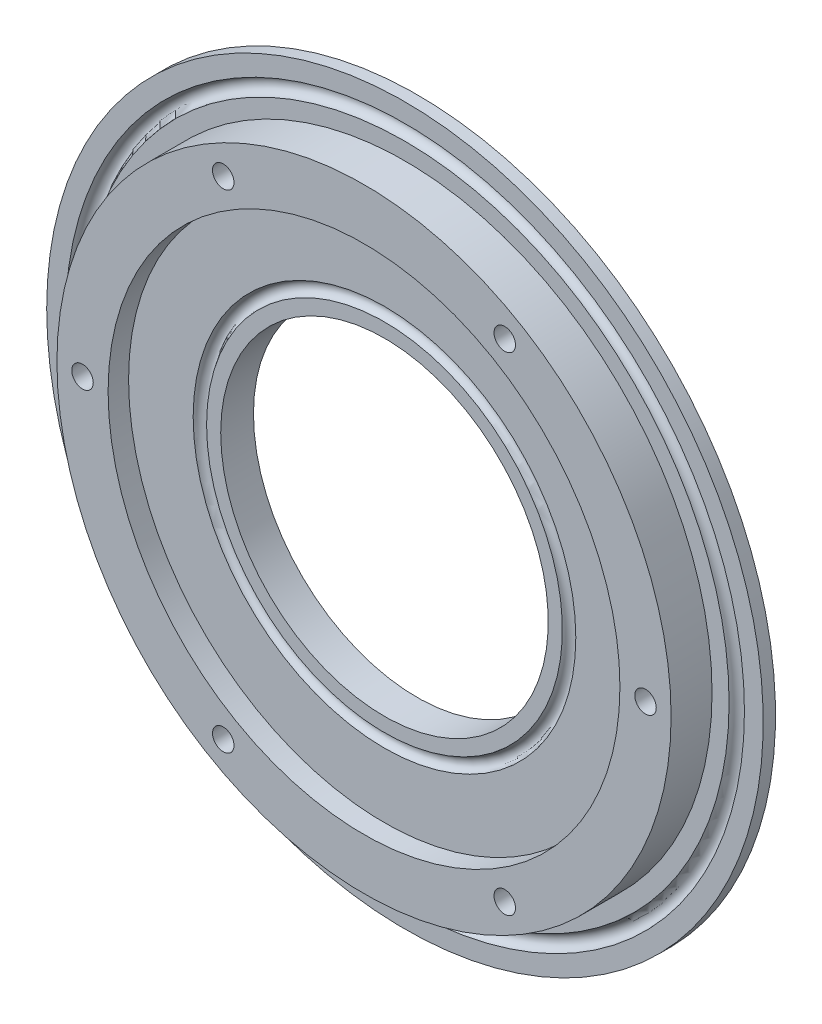
ISO-10303-21;
HEADER;
FILE_DESCRIPTION(('STEP AP214'),'2;1');
FILE_NAME('part.step','',(''),(''),'','','');
FILE_SCHEMA(('AUTOMOTIVE_DESIGN { 1 0 10303 214 1 1 1 1 }'));
ENDSEC;
DATA;
#1=APPLICATION_CONTEXT('core data for automotive mechanical design processes');
#2=APPLICATION_PROTOCOL_DEFINITION('international standard','automotive_design',2000,#1);
#3=PRODUCT_CONTEXT('',#1,'mechanical');
#4=PRODUCT('Part','Part','',(#3));
#5=PRODUCT_RELATED_PRODUCT_CATEGORY('part','',(#4));
#6=PRODUCT_DEFINITION_FORMATION('','',#4);
#7=PRODUCT_DEFINITION_CONTEXT('part definition',#1,'design');
#8=PRODUCT_DEFINITION('design','',#6,#7);
#9=PRODUCT_DEFINITION_SHAPE('','',#8);
#10=(LENGTH_UNIT() NAMED_UNIT(*) SI_UNIT(.MILLI.,.METRE.));
#11=(NAMED_UNIT(*) PLANE_ANGLE_UNIT() SI_UNIT($,.RADIAN.));
#12=(NAMED_UNIT(*) SI_UNIT($,.STERADIAN.) SOLID_ANGLE_UNIT());
#13=UNCERTAINTY_MEASURE_WITH_UNIT(LENGTH_MEASURE(1.E-05),#10,'distance_accuracy_value','');
#14=(GEOMETRIC_REPRESENTATION_CONTEXT(3) GLOBAL_UNCERTAINTY_ASSIGNED_CONTEXT((#13)) GLOBAL_UNIT_ASSIGNED_CONTEXT((#10,
#11,#12)) REPRESENTATION_CONTEXT('',''));
#15=CARTESIAN_POINT('',(0.,0.,0.));
#16=DIRECTION('',(0.,0.,1.));
#17=DIRECTION('',(1.,0.,0.));
#18=AXIS2_PLACEMENT_3D('',#15,#16,#17);
#19=CARTESIAN_POINT('',(0.,1.11022302462516E-13,-1.99999999999992));
#20=DIRECTION('',(0.,0.,-1.));
#21=DIRECTION('',(-1.00000000000001,0.,0.));
#22=AXIS2_PLACEMENT_3D('',#19,#20,#21);
#23=TOROIDAL_SURFACE('',#22,64.83,1.5);
#24=CARTESIAN_POINT('',(0.,1.11022302462516E-13,-2.));
#25=DIRECTION('',(0.,0.,-1.));
#26=DIRECTION('',(-1.00000000000001,0.,0.));
#27=AXIS2_PLACEMENT_3D('',#24,#25,#26);
#28=CIRCLE('',#27,63.33);
#29=CARTESIAN_POINT('',(-63.3300000000007,2.79767320421342E-13,-2.));
#30=VERTEX_POINT('',#29);
#31=EDGE_CURVE('E13',#30,#30,#28,.T.);
#32=ORIENTED_EDGE('',*,*,#31,.T.);
#33=EDGE_LOOP('',(#32));
#34=FACE_BOUND('',#33,.T.);
#35=CARTESIAN_POINT('',(0.,1.11022302462516E-13,-2.));
#36=DIRECTION('',(0.,0.,-1.));
#37=DIRECTION('',(-1.00000000000001,0.,0.));
#38=AXIS2_PLACEMENT_3D('',#35,#36,#37);
#39=CIRCLE('',#38,66.33);
#40=CARTESIAN_POINT('',(-66.3300000000007,2.87760926198644E-13,-2.));
#41=VERTEX_POINT('',#40);
#42=EDGE_CURVE('E122',#41,#41,#39,.T.);
#43=ORIENTED_EDGE('',*,*,#42,.F.);
#44=EDGE_LOOP('',(#43));
#45=FACE_BOUND('',#44,.T.);
#46=ADVANCED_FACE('F51',(#34,#45),#23,.F.);
#47=CARTESIAN_POINT('',(-60.0000000000007,4.44089209850063E-13,-2.));
#48=DIRECTION('',(0.,0.,1.));
#49=DIRECTION('',(1.00000000000001,0.,0.));
#50=AXIS2_PLACEMENT_3D('',#47,#48,#49);
#51=PLANE('',#50);
#52=CARTESIAN_POINT('',(0.,1.11022302462516E-13,-2.));
#53=DIRECTION('',(0.,0.,-1.));
#54=DIRECTION('',(-1.00000000000001,0.,0.));
#55=AXIS2_PLACEMENT_3D('',#52,#53,#54);
#56=CIRCLE('',#55,60.);
#57=CARTESIAN_POINT('',(-60.0000000000006,2.70894418008538E-13,-2.));
#58=VERTEX_POINT('',#57);
#59=EDGE_CURVE('E58',#58,#58,#56,.T.);
#60=ORIENTED_EDGE('',*,*,#59,.T.);
#61=EDGE_LOOP('',(#60));
#62=FACE_BOUND('',#61,.T.);
#63=ORIENTED_EDGE('',*,*,#31,.F.);
#64=EDGE_LOOP('',(#63));
#65=FACE_BOUND('',#64,.T.);
#66=ADVANCED_FACE('F154',(#62,#65),#51,.T.);
#67=CARTESIAN_POINT('',(0.,0.,-4.82603398798231));
#68=DIRECTION('',(0.,0.,-1.));
#69=DIRECTION('',(-1.00000000000001,0.,0.));
#70=AXIS2_PLACEMENT_3D('',#67,#68,#69);
#71=CYLINDRICAL_SURFACE('',#70,60.);
#72=CARTESIAN_POINT('',(0.,0.,6.00000000000001));
#73=DIRECTION('',(0.,0.,-1.));
#74=DIRECTION('',(-1.00000000000001,0.,0.));
#75=AXIS2_PLACEMENT_3D('',#72,#73,#74);
#76=CIRCLE('',#75,60.);
#77=CARTESIAN_POINT('',(-60.0000000000006,1.87627691161651E-13,6.00000000000001));
#78=VERTEX_POINT('',#77);
#79=EDGE_CURVE('E149',#78,#78,#76,.T.);
#80=ORIENTED_EDGE('',*,*,#79,.T.);
#81=EDGE_LOOP('',(#80));
#82=FACE_BOUND('',#81,.T.);
#83=ORIENTED_EDGE('',*,*,#59,.F.);
#84=EDGE_LOOP('',(#83));
#85=FACE_BOUND('',#84,.T.);
#86=ADVANCED_FACE('F157',(#82,#85),#71,.T.);
#87=CARTESIAN_POINT('',(-50.0000000000006,2.91433543964104E-13,5.99999999999937));
#88=DIRECTION('',(0.,0.,1.));
#89=DIRECTION('',(1.00000000000001,0.,0.));
#90=AXIS2_PLACEMENT_3D('',#87,#88,#89);
#91=PLANE('',#90);
#92=CARTESIAN_POINT('',(-27.5000000000003,47.6313972081445,6.00000000000001));
#93=DIRECTION('',(0.,0.,1.));
#94=DIRECTION('',(1.00000000000001,0.,0.));
#95=AXIS2_PLACEMENT_3D('',#92,#93,#94);
#96=CIRCLE('',#95,2.09999999999999);
#97=CARTESIAN_POINT('',(-25.4000000000003,47.6313972081445,6.00000000000001));
#98=VERTEX_POINT('',#97);
#99=EDGE_CURVE('E88',#98,#98,#96,.T.);
#100=ORIENTED_EDGE('',*,*,#99,.F.);
#101=EDGE_LOOP('',(#100));
#102=FACE_BOUND('',#101,.T.);
#103=CARTESIAN_POINT('',(27.5000000000002,47.6313972081442,6.00000000000001));
#104=DIRECTION('',(0.,0.,1.));
#105=DIRECTION('',(1.00000000000001,0.,0.));
#106=AXIS2_PLACEMENT_3D('',#103,#104,#105);
#107=CIRCLE('',#106,2.09999999999999);
#108=CARTESIAN_POINT('',(29.6000000000002,47.6313972081442,6.00000000000001));
#109=VERTEX_POINT('',#108);
#110=EDGE_CURVE('E87',#109,#109,#107,.T.);
#111=ORIENTED_EDGE('',*,*,#110,.F.);
#112=EDGE_LOOP('',(#111));
#113=FACE_BOUND('',#112,.T.);
#114=CARTESIAN_POINT('',(55.0000000000005,0.,6.00000000000001));
#115=DIRECTION('',(0.,0.,1.));
#116=DIRECTION('',(1.00000000000001,0.,0.));
#117=AXIS2_PLACEMENT_3D('',#114,#115,#116);
#118=CIRCLE('',#117,2.09999999999999);
#119=CARTESIAN_POINT('',(57.1000000000005,0.,6.00000000000001));
#120=VERTEX_POINT('',#119);
#121=EDGE_CURVE('E98',#120,#120,#118,.T.);
#122=ORIENTED_EDGE('',*,*,#121,.F.);
#123=EDGE_LOOP('',(#122));
#124=FACE_BOUND('',#123,.T.);
#125=CARTESIAN_POINT('',(27.5000000000001,-47.6313972081441,6.00000000000001));
#126=DIRECTION('',(0.,0.,1.));
#127=DIRECTION('',(1.00000000000001,0.,0.));
#128=AXIS2_PLACEMENT_3D('',#125,#126,#127);
#129=CIRCLE('',#128,2.09999999999999);
#130=CARTESIAN_POINT('',(29.6000000000001,-47.6313972081441,6.00000000000001));
#131=VERTEX_POINT('',#130);
#132=EDGE_CURVE('E104',#131,#131,#129,.T.);
#133=ORIENTED_EDGE('',*,*,#132,.F.);
#134=EDGE_LOOP('',(#133));
#135=FACE_BOUND('',#134,.T.);
#136=CARTESIAN_POINT('',(-27.5,-47.6313972081441,6.00000000000001));
#137=DIRECTION('',(0.,0.,1.));
#138=DIRECTION('',(1.00000000000001,0.,0.));
#139=AXIS2_PLACEMENT_3D('',#136,#137,#138);
#140=CIRCLE('',#139,2.09999999999999);
#141=CARTESIAN_POINT('',(-25.4,-47.6313972081441,6.00000000000001));
#142=VERTEX_POINT('',#141);
#143=EDGE_CURVE('E110',#142,#142,#140,.T.);
#144=ORIENTED_EDGE('',*,*,#143,.F.);
#145=EDGE_LOOP('',(#144));
#146=FACE_BOUND('',#145,.T.);
#147=CARTESIAN_POINT('',(-55.0000000000006,3.46944695195361E-13,6.00000000000001));
#148=DIRECTION('',(0.,0.,1.));
#149=DIRECTION('',(1.00000000000001,0.,0.));
#150=AXIS2_PLACEMENT_3D('',#147,#148,#149);
#151=CIRCLE('',#150,2.09999999999999);
#152=CARTESIAN_POINT('',(-52.9000000000006,3.41349171151251E-13,6.00000000000001));
#153=VERTEX_POINT('',#152);
#154=EDGE_CURVE('E116',#153,#153,#151,.T.);
#155=ORIENTED_EDGE('',*,*,#154,.F.);
#156=EDGE_LOOP('',(#155));
#157=FACE_BOUND('',#156,.T.);
#158=CARTESIAN_POINT('',(0.,0.,6.00000000000001));
#159=DIRECTION('',(0.,0.,-1.));
#160=DIRECTION('',(-1.00000000000001,0.,0.));
#161=AXIS2_PLACEMENT_3D('',#158,#159,#160);
#162=CIRCLE('',#161,50.);
#163=CARTESIAN_POINT('',(-50.0000000000005,1.60982338570648E-13,6.00000000000001));
#164=VERTEX_POINT('',#163);
#165=EDGE_CURVE('E146',#164,#164,#162,.T.);
#166=ORIENTED_EDGE('',*,*,#165,.T.);
#167=EDGE_LOOP('',(#166));
#168=FACE_BOUND('',#167,.T.);
#169=ORIENTED_EDGE('',*,*,#79,.F.);
#170=EDGE_LOOP('',(#169));
#171=FACE_BOUND('',#170,.T.);
#172=ADVANCED_FACE('F159',(#102,#113,#124,#135,#146,#157,#168,#171),#91,.T.);
#173=CARTESIAN_POINT('',(0.,0.,-4.82603398798231));
#174=DIRECTION('',(0.,0.,-1.));
#175=DIRECTION('',(-1.00000000000001,0.,0.));
#176=AXIS2_PLACEMENT_3D('',#173,#174,#175);
#177=CYLINDRICAL_SURFACE('',#176,50.);
#178=CARTESIAN_POINT('',(0.,0.,2.));
#179=DIRECTION('',(0.,0.,-1.));
#180=DIRECTION('',(-1.00000000000001,0.,0.));
#181=AXIS2_PLACEMENT_3D('',#178,#179,#180);
#182=CIRCLE('',#181,50.);
#183=CARTESIAN_POINT('',(-50.0000000000005,1.60982338570648E-13,2.));
#184=VERTEX_POINT('',#183);
#185=EDGE_CURVE('E143',#184,#184,#182,.T.);
#186=ORIENTED_EDGE('',*,*,#185,.T.);
#187=EDGE_LOOP('',(#186));
#188=FACE_BOUND('',#187,.T.);
#189=ORIENTED_EDGE('',*,*,#165,.F.);
#190=EDGE_LOOP('',(#189));
#191=FACE_BOUND('',#190,.T.);
#192=ADVANCED_FACE('F166',(#188,#191),#177,.F.);
#193=CARTESIAN_POINT('',(-37.3800000000004,1.94289029309402E-13,1.99999999999997));
#194=DIRECTION('',(0.,0.,1.));
#195=DIRECTION('',(1.00000000000001,0.,0.));
#196=AXIS2_PLACEMENT_3D('',#193,#194,#195);
#197=PLANE('',#196);
#198=CARTESIAN_POINT('',(0.,0.,2.));
#199=DIRECTION('',(0.,0.,-1.));
#200=DIRECTION('',(-1.00000000000001,0.,0.));
#201=AXIS2_PLACEMENT_3D('',#198,#199,#200);
#202=CIRCLE('',#201,37.38);
#203=CARTESIAN_POINT('',(-37.3800000000004,1.27355903600801E-13,2.));
#204=VERTEX_POINT('',#203);
#205=EDGE_CURVE('E140',#204,#204,#202,.T.);
#206=ORIENTED_EDGE('',*,*,#205,.T.);
#207=EDGE_LOOP('',(#206));
#208=FACE_BOUND('',#207,.T.);
#209=ORIENTED_EDGE('',*,*,#185,.F.);
#210=EDGE_LOOP('',(#209));
#211=FACE_BOUND('',#210,.T.);
#212=ADVANCED_FACE('F211',(#208,#211),#197,.T.);
#213=CARTESIAN_POINT('',(0.,0.,2.16217274740227));
#214=DIRECTION('',(0.,0.,-1.));
#215=DIRECTION('',(-1.00000000000001,0.,0.));
#216=AXIS2_PLACEMENT_3D('',#213,#214,#215);
#217=TOROIDAL_SURFACE('',#216,36.07,1.32);
#218=CARTESIAN_POINT('',(0.,0.,2.));
#219=DIRECTION('',(0.,0.,-1.));
#220=DIRECTION('',(-1.00000000000001,0.,0.));
#221=AXIS2_PLACEMENT_3D('',#218,#219,#220);
#222=CIRCLE('',#221,34.76);
#223=CARTESIAN_POINT('',(-34.7600000000004,1.20374821221958E-13,2.));
#224=VERTEX_POINT('',#223);
#225=EDGE_CURVE('E137',#224,#224,#222,.T.);
#226=ORIENTED_EDGE('',*,*,#225,.T.);
#227=EDGE_LOOP('',(#226));
#228=FACE_BOUND('',#227,.T.);
#229=ORIENTED_EDGE('',*,*,#205,.F.);
#230=EDGE_LOOP('',(#229));
#231=FACE_BOUND('',#230,.T.);
#232=ADVANCED_FACE('F205',(#228,#231),#217,.F.);
#233=CARTESIAN_POINT('',(-32.0000000000001,0.,2.));
#234=DIRECTION('',(0.,0.,1.));
#235=DIRECTION('',(1.00000000000001,0.,0.));
#236=AXIS2_PLACEMENT_3D('',#233,#234,#235);
#237=PLANE('',#236);
#238=CARTESIAN_POINT('',(0.,0.,2.));
#239=DIRECTION('',(0.,0.,-1.));
#240=DIRECTION('',(-1.00000000000001,0.,0.));
#241=AXIS2_PLACEMENT_3D('',#238,#239,#240);
#242=CIRCLE('',#241,32.);
#243=CARTESIAN_POINT('',(-32.0000000000003,1.13020703906841E-13,2.));
#244=VERTEX_POINT('',#243);
#245=EDGE_CURVE('E134',#244,#244,#242,.T.);
#246=ORIENTED_EDGE('',*,*,#245,.T.);
#247=EDGE_LOOP('',(#246));
#248=FACE_BOUND('',#247,.T.);
#249=ORIENTED_EDGE('',*,*,#225,.F.);
#250=EDGE_LOOP('',(#249));
#251=FACE_BOUND('',#250,.T.);
#252=ADVANCED_FACE('F199',(#248,#251),#237,.T.);
#253=CARTESIAN_POINT('',(0.,0.,-4.82603398798231));
#254=DIRECTION('',(0.,0.,-1.));
#255=DIRECTION('',(-1.00000000000001,0.,0.));
#256=AXIS2_PLACEMENT_3D('',#253,#254,#255);
#257=CYLINDRICAL_SURFACE('',#256,32.);
#258=CARTESIAN_POINT('',(0.,0.,-4.40000000000001));
#259=DIRECTION('',(0.,0.,-1.));
#260=DIRECTION('',(-1.00000000000001,0.,0.));
#261=AXIS2_PLACEMENT_3D('',#258,#259,#260);
#262=CIRCLE('',#261,32.);
#263=CARTESIAN_POINT('',(-32.0000000000003,0.,-4.40000000000001));
#264=VERTEX_POINT('',#263);
#265=EDGE_CURVE('E131',#264,#264,#262,.T.);
#266=ORIENTED_EDGE('',*,*,#265,.T.);
#267=EDGE_LOOP('',(#266));
#268=FACE_BOUND('',#267,.T.);
#269=ORIENTED_EDGE('',*,*,#245,.F.);
#270=EDGE_LOOP('',(#269));
#271=FACE_BOUND('',#270,.T.);
#272=ADVANCED_FACE('F193',(#268,#271),#257,.F.);
#273=CARTESIAN_POINT('',(-70.0000000000002,1.38777878078145E-13,-4.40000000000001));
#274=DIRECTION('',(0.,0.,-1.));
#275=DIRECTION('',(-1.00000000000001,0.,0.));
#276=AXIS2_PLACEMENT_3D('',#273,#274,#275);
#277=PLANE('',#276);
#278=CARTESIAN_POINT('',(0.,0.,-4.40000000000001));
#279=DIRECTION('',(0.,0.,-1.));
#280=DIRECTION('',(-1.00000000000001,0.,0.));
#281=AXIS2_PLACEMENT_3D('',#278,#279,#280);
#282=CIRCLE('',#281,70.);
#283=CARTESIAN_POINT('',(-70.0000000000007,2.00395255944841E-13,-4.40000000000001));
#284=VERTEX_POINT('',#283);
#285=EDGE_CURVE('E128',#284,#284,#282,.T.);
#286=ORIENTED_EDGE('',*,*,#285,.T.);
#287=EDGE_LOOP('',(#286));
#288=FACE_BOUND('',#287,.T.);
#289=ORIENTED_EDGE('',*,*,#265,.F.);
#290=EDGE_LOOP('',(#289));
#291=FACE_BOUND('',#290,.T.);
#292=ADVANCED_FACE('F187',(#288,#291),#277,.T.);
#293=CARTESIAN_POINT('',(0.,0.,-4.82603398798231));
#294=DIRECTION('',(0.,0.,-1.));
#295=DIRECTION('',(-1.00000000000001,0.,0.));
#296=AXIS2_PLACEMENT_3D('',#293,#294,#295);
#297=CYLINDRICAL_SURFACE('',#296,70.);
#298=CARTESIAN_POINT('',(0.,1.11022302462516E-13,-2.));
#299=DIRECTION('',(0.,0.,-1.));
#300=DIRECTION('',(-1.00000000000001,0.,0.));
#301=AXIS2_PLACEMENT_3D('',#298,#299,#300);
#302=CIRCLE('',#301,70.);
#303=CARTESIAN_POINT('',(-70.0000000000007,2.97539770599542E-13,-2.));
#304=VERTEX_POINT('',#303);
#305=EDGE_CURVE('E125',#304,#304,#302,.T.);
#306=ORIENTED_EDGE('',*,*,#305,.T.);
#307=EDGE_LOOP('',(#306));
#308=FACE_BOUND('',#307,.T.);
#309=ORIENTED_EDGE('',*,*,#285,.F.);
#310=EDGE_LOOP('',(#309));
#311=FACE_BOUND('',#310,.T.);
#312=ADVANCED_FACE('F181',(#308,#311),#297,.T.);
#313=CARTESIAN_POINT('',(-66.3300000000007,4.16333634234434E-13,-2.00000000000003));
#314=DIRECTION('',(0.,0.,1.));
#315=DIRECTION('',(1.00000000000001,0.,0.));
#316=AXIS2_PLACEMENT_3D('',#313,#314,#315);
#317=PLANE('',#316);
#318=ORIENTED_EDGE('',*,*,#42,.T.);
#319=EDGE_LOOP('',(#318));
#320=FACE_BOUND('',#319,.T.);
#321=ORIENTED_EDGE('',*,*,#305,.F.);
#322=EDGE_LOOP('',(#321));
#323=FACE_BOUND('',#322,.T.);
#324=ADVANCED_FACE('F177',(#320,#323),#317,.T.);
#325=CARTESIAN_POINT('',(-55.0000000000005,2.4980018054066E-13,-1.));
#326=DIRECTION('',(0.,0.,1.));
#327=DIRECTION('',(1.00000000000001,0.,0.));
#328=AXIS2_PLACEMENT_3D('',#325,#326,#327);
#329=CONICAL_SURFACE('',#328,2.1,1.02974425867665);
#330=CARTESIAN_POINT('',(-55.0000000000007,4.30211422042248E-13,-2.26180729995787));
#331=VERTEX_POINT('',#330);
#332=VERTEX_LOOP('',#331);
#333=FACE_BOUND('',#332,.T.);
#334=CARTESIAN_POINT('',(-55.0000000000005,2.4980018054066E-13,-1.));
#335=DIRECTION('',(0.,0.,1.));
#336=DIRECTION('',(1.00000000000001,0.,0.));
#337=AXIS2_PLACEMENT_3D('',#334,#335,#336);
#338=CIRCLE('',#337,2.1);
#339=CARTESIAN_POINT('',(-52.9000000000005,2.44204656496549E-13,-1.));
#340=VERTEX_POINT('',#339);
#341=EDGE_CURVE('E119',#340,#340,#338,.T.);
#342=ORIENTED_EDGE('',*,*,#341,.T.);
#343=EDGE_LOOP('',(#342));
#344=FACE_BOUND('',#343,.T.);
#345=ADVANCED_FACE('F180',(#333,#344),#329,.F.);
#346=CARTESIAN_POINT('',(-55.0000000000006,3.46944695195361E-13,6.00000000000001));
#347=DIRECTION('',(0.,0.,1.));
#348=DIRECTION('',(1.00000000000001,0.,0.));
#349=AXIS2_PLACEMENT_3D('',#346,#347,#348);
#350=CYLINDRICAL_SURFACE('',#349,2.09999999999999);
#351=ORIENTED_EDGE('',*,*,#341,.F.);
#352=EDGE_LOOP('',(#351));
#353=FACE_BOUND('',#352,.T.);
#354=ORIENTED_EDGE('',*,*,#154,.T.);
#355=EDGE_LOOP('',(#354));
#356=FACE_BOUND('',#355,.T.);
#357=ADVANCED_FACE('F232',(#353,#356),#350,.F.);
#358=CARTESIAN_POINT('',(-27.5000000000003,-47.631397208144,-1.));
#359=DIRECTION('',(0.,0.,1.));
#360=DIRECTION('',(1.00000000000001,0.,0.));
#361=AXIS2_PLACEMENT_3D('',#358,#359,#360);
#362=CONICAL_SURFACE('',#361,2.1,1.02974425867665);
#363=CARTESIAN_POINT('',(-27.5000000000003,-47.631397208144,-2.26180729995787));
#364=VERTEX_POINT('',#363);
#365=VERTEX_LOOP('',#364);
#366=FACE_BOUND('',#365,.T.);
#367=CARTESIAN_POINT('',(-27.5000000000003,-47.631397208144,-1.));
#368=DIRECTION('',(0.,0.,1.));
#369=DIRECTION('',(1.00000000000001,0.,0.));
#370=AXIS2_PLACEMENT_3D('',#367,#368,#369);
#371=CIRCLE('',#370,2.1);
#372=CARTESIAN_POINT('',(-25.4000000000003,-47.631397208144,-1.));
#373=VERTEX_POINT('',#372);
#374=EDGE_CURVE('E113',#373,#373,#371,.T.);
#375=ORIENTED_EDGE('',*,*,#374,.T.);
#376=EDGE_LOOP('',(#375));
#377=FACE_BOUND('',#376,.T.);
#378=ADVANCED_FACE('F235',(#366,#377),#362,.F.);
#379=CARTESIAN_POINT('',(-27.5,-47.6313972081441,6.00000000000001));
#380=DIRECTION('',(0.,0.,1.));
#381=DIRECTION('',(1.00000000000001,0.,0.));
#382=AXIS2_PLACEMENT_3D('',#379,#380,#381);
#383=CYLINDRICAL_SURFACE('',#382,2.09999999999999);
#384=ORIENTED_EDGE('',*,*,#374,.F.);
#385=EDGE_LOOP('',(#384));
#386=FACE_BOUND('',#385,.T.);
#387=ORIENTED_EDGE('',*,*,#143,.T.);
#388=EDGE_LOOP('',(#387));
#389=FACE_BOUND('',#388,.T.);
#390=ADVANCED_FACE('F239',(#386,#389),#383,.F.);
#391=CARTESIAN_POINT('',(27.5,-47.6313972081442,-1.));
#392=DIRECTION('',(0.,0.,1.));
#393=DIRECTION('',(1.00000000000001,0.,0.));
#394=AXIS2_PLACEMENT_3D('',#391,#392,#393);
#395=CONICAL_SURFACE('',#394,2.1,1.02974425867665);
#396=CARTESIAN_POINT('',(27.5,-47.6313972081442,-2.26180729995787));
#397=VERTEX_POINT('',#396);
#398=VERTEX_LOOP('',#397);
#399=FACE_BOUND('',#398,.T.);
#400=CARTESIAN_POINT('',(27.5,-47.6313972081442,-1.));
#401=DIRECTION('',(0.,0.,1.));
#402=DIRECTION('',(1.00000000000001,0.,0.));
#403=AXIS2_PLACEMENT_3D('',#400,#401,#402);
#404=CIRCLE('',#403,2.1);
#405=CARTESIAN_POINT('',(29.6,-47.6313972081442,-1.));
#406=VERTEX_POINT('',#405);
#407=EDGE_CURVE('E107',#406,#406,#404,.T.);
#408=ORIENTED_EDGE('',*,*,#407,.T.);
#409=EDGE_LOOP('',(#408));
#410=FACE_BOUND('',#409,.T.);
#411=ADVANCED_FACE('F242',(#399,#410),#395,.F.);
#412=CARTESIAN_POINT('',(27.5000000000001,-47.6313972081441,6.00000000000001));
#413=DIRECTION('',(0.,0.,1.));
#414=DIRECTION('',(1.00000000000001,0.,0.));
#415=AXIS2_PLACEMENT_3D('',#412,#413,#414);
#416=CYLINDRICAL_SURFACE('',#415,2.09999999999999);
#417=ORIENTED_EDGE('',*,*,#407,.F.);
#418=EDGE_LOOP('',(#417));
#419=FACE_BOUND('',#418,.T.);
#420=ORIENTED_EDGE('',*,*,#132,.T.);
#421=EDGE_LOOP('',(#420));
#422=FACE_BOUND('',#421,.T.);
#423=ADVANCED_FACE('F246',(#419,#422),#416,.F.);
#424=CARTESIAN_POINT('',(55.0000000000004,-1.38777878078145E-13,-1.));
#425=DIRECTION('',(0.,0.,1.));
#426=DIRECTION('',(1.00000000000001,0.,0.));
#427=AXIS2_PLACEMENT_3D('',#424,#425,#426);
#428=CONICAL_SURFACE('',#427,2.1,1.02974425867665);
#429=CARTESIAN_POINT('',(55.0000000000005,0.,-2.26180729995787));
#430=VERTEX_POINT('',#429);
#431=VERTEX_LOOP('',#430);
#432=FACE_BOUND('',#431,.T.);
#433=CARTESIAN_POINT('',(55.0000000000004,-1.38777878078145E-13,-1.));
#434=DIRECTION('',(0.,0.,1.));
#435=DIRECTION('',(1.00000000000001,0.,0.));
#436=AXIS2_PLACEMENT_3D('',#433,#434,#435);
#437=CIRCLE('',#436,2.1);
#438=CARTESIAN_POINT('',(57.1000000000005,-1.44373402122255E-13,-1.));
#439=VERTEX_POINT('',#438);
#440=EDGE_CURVE('E101',#439,#439,#437,.T.);
#441=ORIENTED_EDGE('',*,*,#440,.T.);
#442=EDGE_LOOP('',(#441));
#443=FACE_BOUND('',#442,.T.);
#444=ADVANCED_FACE('F250',(#432,#443),#428,.F.);
#445=CARTESIAN_POINT('',(55.0000000000005,0.,6.00000000000001));
#446=DIRECTION('',(0.,0.,1.));
#447=DIRECTION('',(1.00000000000001,0.,0.));
#448=AXIS2_PLACEMENT_3D('',#445,#446,#447);
#449=CYLINDRICAL_SURFACE('',#448,2.09999999999999);
#450=ORIENTED_EDGE('',*,*,#440,.F.);
#451=EDGE_LOOP('',(#450));
#452=FACE_BOUND('',#451,.T.);
#453=ORIENTED_EDGE('',*,*,#121,.T.);
#454=EDGE_LOOP('',(#453));
#455=FACE_BOUND('',#454,.T.);
#456=ADVANCED_FACE('F254',(#452,#455),#449,.F.);
#457=CARTESIAN_POINT('',(27.5,47.6313972081441,-1.));
#458=DIRECTION('',(0.,0.,1.));
#459=DIRECTION('',(1.00000000000001,0.,0.));
#460=AXIS2_PLACEMENT_3D('',#457,#458,#459);
#461=CONICAL_SURFACE('',#460,2.1,1.02974425867665);
#462=CARTESIAN_POINT('',(27.5,47.6313972081441,-2.26180729995787));
#463=VERTEX_POINT('',#462);
#464=VERTEX_LOOP('',#463);
#465=FACE_BOUND('',#464,.T.);
#466=CARTESIAN_POINT('',(27.5,47.6313972081441,-1.));
#467=DIRECTION('',(0.,0.,1.));
#468=DIRECTION('',(1.00000000000001,0.,0.));
#469=AXIS2_PLACEMENT_3D('',#466,#467,#468);
#470=CIRCLE('',#469,2.1);
#471=CARTESIAN_POINT('',(29.6,47.6313972081441,-1.));
#472=VERTEX_POINT('',#471);
#473=EDGE_CURVE('E91',#472,#472,#470,.T.);
#474=ORIENTED_EDGE('',*,*,#473,.T.);
#475=EDGE_LOOP('',(#474));
#476=FACE_BOUND('',#475,.T.);
#477=ADVANCED_FACE('F258',(#465,#476),#461,.F.);
#478=CARTESIAN_POINT('',(27.5000000000002,47.6313972081442,6.00000000000001));
#479=DIRECTION('',(0.,0.,1.));
#480=DIRECTION('',(1.00000000000001,0.,0.));
#481=AXIS2_PLACEMENT_3D('',#478,#479,#480);
#482=CYLINDRICAL_SURFACE('',#481,2.09999999999999);
#483=ORIENTED_EDGE('',*,*,#473,.F.);
#484=EDGE_LOOP('',(#483));
#485=FACE_BOUND('',#484,.T.);
#486=ORIENTED_EDGE('',*,*,#110,.T.);
#487=EDGE_LOOP('',(#486));
#488=FACE_BOUND('',#487,.T.);
#489=ADVANCED_FACE('F81',(#485,#488),#482,.F.);
#490=CARTESIAN_POINT('',(-27.5000000000006,47.6313972081442,-1.));
#491=DIRECTION('',(0.,0.,1.));
#492=DIRECTION('',(1.00000000000001,0.,0.));
#493=AXIS2_PLACEMENT_3D('',#490,#491,#492);
#494=CONICAL_SURFACE('',#493,2.1,1.02974425867665);
#495=CARTESIAN_POINT('',(-27.5000000000004,47.6313972081442,-2.26180729995787));
#496=VERTEX_POINT('',#495);
#497=VERTEX_LOOP('',#496);
#498=FACE_BOUND('',#497,.T.);
#499=CARTESIAN_POINT('',(-27.5000000000006,47.6313972081442,-1.));
#500=DIRECTION('',(0.,0.,1.));
#501=DIRECTION('',(1.00000000000001,0.,0.));
#502=AXIS2_PLACEMENT_3D('',#499,#500,#501);
#503=CIRCLE('',#502,2.1);
#504=CARTESIAN_POINT('',(-25.4000000000005,47.6313972081442,-1.));
#505=VERTEX_POINT('',#504);
#506=EDGE_CURVE('E85',#505,#505,#503,.T.);
#507=ORIENTED_EDGE('',*,*,#506,.T.);
#508=EDGE_LOOP('',(#507));
#509=FACE_BOUND('',#508,.T.);
#510=ADVANCED_FACE('F77',(#498,#509),#494,.F.);
#511=CARTESIAN_POINT('',(-27.5000000000003,47.6313972081445,6.00000000000001));
#512=DIRECTION('',(0.,0.,1.));
#513=DIRECTION('',(1.00000000000001,0.,0.));
#514=AXIS2_PLACEMENT_3D('',#511,#512,#513);
#515=CYLINDRICAL_SURFACE('',#514,2.09999999999999);
#516=ORIENTED_EDGE('',*,*,#506,.F.);
#517=EDGE_LOOP('',(#516));
#518=FACE_BOUND('',#517,.T.);
#519=ORIENTED_EDGE('',*,*,#99,.T.);
#520=EDGE_LOOP('',(#519));
#521=FACE_BOUND('',#520,.T.);
#522=ADVANCED_FACE('F80',(#518,#521),#515,.F.);
#523=CLOSED_SHELL('',(#46,#66,#86,#172,#192,#212,#232,#252,#272,#292,#312,#324,#345,#357,#378,
#390,#411,#423,#444,#456,#477,#489,#510,#522));
#524=MANIFOLD_SOLID_BREP('B2',#523);
#525=ADVANCED_BREP_SHAPE_REPRESENTATION('',(#18,#524),#14);
#526=SHAPE_DEFINITION_REPRESENTATION(#9,#525);
ENDSEC;
END-ISO-10303-21;
